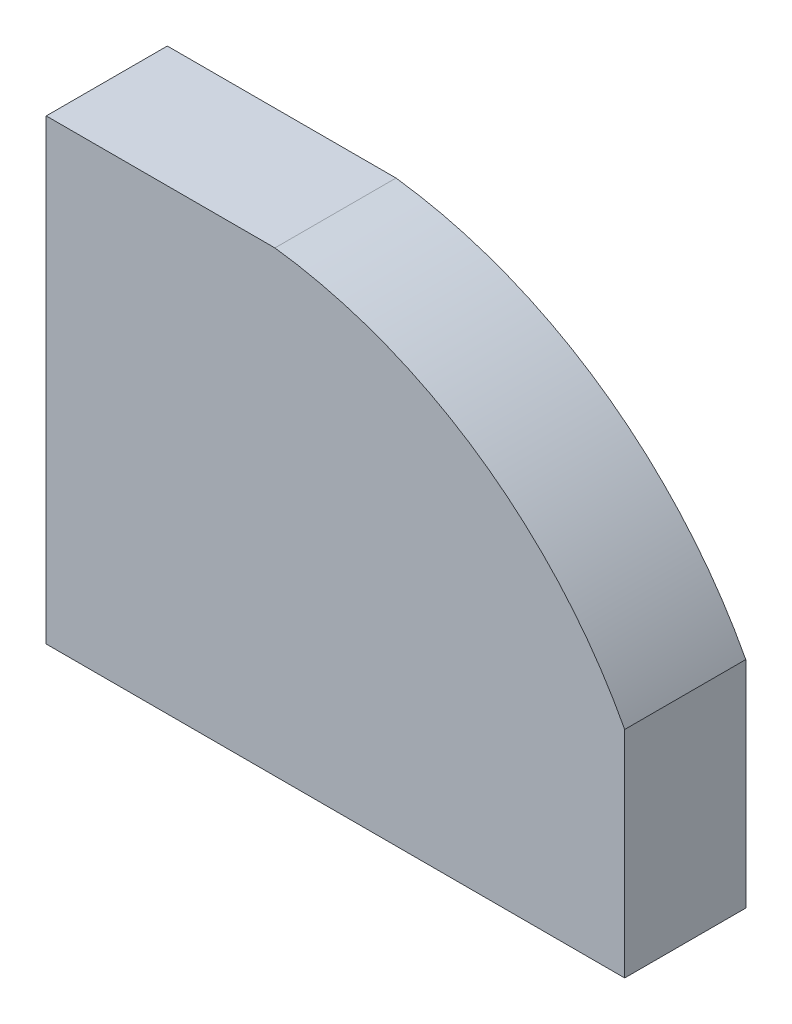
ISO-10303-21;
HEADER;
FILE_DESCRIPTION(('STEP AP214'),'2;1');
FILE_NAME('part.step','',(''),(''),'','','');
FILE_SCHEMA(('AUTOMOTIVE_DESIGN { 1 0 10303 214 1 1 1 1 }'));
ENDSEC;
DATA;
#1=APPLICATION_CONTEXT('core data for automotive mechanical design processes');
#2=APPLICATION_PROTOCOL_DEFINITION('international standard','automotive_design',2000,#1);
#3=PRODUCT_CONTEXT('',#1,'mechanical');
#4=PRODUCT('Part','Part','',(#3));
#5=PRODUCT_RELATED_PRODUCT_CATEGORY('part','',(#4));
#6=PRODUCT_DEFINITION_FORMATION('','',#4);
#7=PRODUCT_DEFINITION_CONTEXT('part definition',#1,'design');
#8=PRODUCT_DEFINITION('design','',#6,#7);
#9=PRODUCT_DEFINITION_SHAPE('','',#8);
#10=(LENGTH_UNIT() NAMED_UNIT(*) SI_UNIT(.MILLI.,.METRE.));
#11=(NAMED_UNIT(*) PLANE_ANGLE_UNIT() SI_UNIT($,.RADIAN.));
#12=(NAMED_UNIT(*) SI_UNIT($,.STERADIAN.) SOLID_ANGLE_UNIT());
#13=UNCERTAINTY_MEASURE_WITH_UNIT(LENGTH_MEASURE(1.E-05),#10,'distance_accuracy_value','');
#14=(GEOMETRIC_REPRESENTATION_CONTEXT(3) GLOBAL_UNCERTAINTY_ASSIGNED_CONTEXT((#13)) GLOBAL_UNIT_ASSIGNED_CONTEXT((#10,
#11,#12)) REPRESENTATION_CONTEXT('',''));
#15=CARTESIAN_POINT('',(0.,0.,0.));
#16=DIRECTION('',(0.,0.,1.));
#17=DIRECTION('',(1.,0.,0.));
#18=AXIS2_PLACEMENT_3D('',#15,#16,#17);
#19=CARTESIAN_POINT('',(12.6923076923077,0.,9.));
#20=DIRECTION('',(0.,0.,-1.));
#21=DIRECTION('',(-1.,0.,0.));
#22=AXIS2_PLACEMENT_3D('',#19,#20,#21);
#23=CYLINDRICAL_SURFACE('',#22,34.2717990922238);
#24=CARTESIAN_POINT('',(12.6923076923077,0.,0.));
#25=DIRECTION('',(0.,0.,1.));
#26=DIRECTION('',(1.,0.,0.));
#27=AXIS2_PLACEMENT_3D('',#24,#25,#26);
#28=CIRCLE('',#27,34.2717990922238);
#29=CARTESIAN_POINT('',(17.,34.,0.));
#30=VERTEX_POINT('',#29);
#31=CARTESIAN_POINT('',(43.,16.,0.));
#32=VERTEX_POINT('',#31);
#33=EDGE_CURVE('E113',#30,#32,#28,.F.);
#34=ORIENTED_EDGE('',*,*,#33,.F.);
#35=DIRECTION('',(0.,0.,-1.));
#36=VECTOR('',#35,1.);
#37=CARTESIAN_POINT('',(17.,34.,9.));
#38=LINE('',#37,#36);
#39=CARTESIAN_POINT('',(17.,34.,9.));
#40=VERTEX_POINT('',#39);
#41=EDGE_CURVE('E11',#40,#30,#38,.T.);
#42=ORIENTED_EDGE('',*,*,#41,.F.);
#43=CARTESIAN_POINT('',(12.6923076923077,0.,9.));
#44=DIRECTION('',(0.,0.,1.));
#45=DIRECTION('',(1.,0.,0.));
#46=AXIS2_PLACEMENT_3D('',#43,#44,#45);
#47=CIRCLE('',#46,34.2717990922238);
#48=CARTESIAN_POINT('',(43.,16.,9.));
#49=VERTEX_POINT('',#48);
#50=EDGE_CURVE('E124',#40,#49,#47,.F.);
#51=ORIENTED_EDGE('',*,*,#50,.T.);
#52=DIRECTION('',(0.,0.,-1.));
#53=VECTOR('',#52,1.);
#54=CARTESIAN_POINT('',(43.,16.,9.));
#55=LINE('',#54,#53);
#56=EDGE_CURVE('E83',#49,#32,#55,.T.);
#57=ORIENTED_EDGE('',*,*,#56,.T.);
#58=EDGE_LOOP('',(#34,#42,#51,#57));
#59=FACE_BOUND('',#58,.T.);
#60=ADVANCED_FACE('F41',(#59),#23,.T.);
#61=CARTESIAN_POINT('',(0.,34.,9.));
#62=DIRECTION('',(0.,1.,0.));
#63=DIRECTION('',(0.,0.,1.));
#64=AXIS2_PLACEMENT_3D('',#61,#62,#63);
#65=PLANE('',#64);
#66=DIRECTION('',(1.,0.,0.));
#67=VECTOR('',#66,1.);
#68=CARTESIAN_POINT('',(0.,34.,0.));
#69=LINE('',#68,#67);
#70=CARTESIAN_POINT('',(0.,34.,0.));
#71=VERTEX_POINT('',#70);
#72=EDGE_CURVE('E116',#71,#30,#69,.T.);
#73=ORIENTED_EDGE('',*,*,#72,.F.);
#74=DIRECTION('',(0.,0.,-1.));
#75=VECTOR('',#74,1.);
#76=CARTESIAN_POINT('',(0.,34.,9.));
#77=LINE('',#76,#75);
#78=CARTESIAN_POINT('',(0.,34.,9.));
#79=VERTEX_POINT('',#78);
#80=EDGE_CURVE('E49',#79,#71,#77,.T.);
#81=ORIENTED_EDGE('',*,*,#80,.F.);
#82=DIRECTION('',(1.,0.,0.));
#83=VECTOR('',#82,1.);
#84=CARTESIAN_POINT('',(0.,34.,9.));
#85=LINE('',#84,#83);
#86=EDGE_CURVE('E99',#79,#40,#85,.T.);
#87=ORIENTED_EDGE('',*,*,#86,.T.);
#88=ORIENTED_EDGE('',*,*,#41,.T.);
#89=EDGE_LOOP('',(#73,#81,#87,#88));
#90=FACE_BOUND('',#89,.T.);
#91=ADVANCED_FACE('F131',(#90),#65,.T.);
#92=CARTESIAN_POINT('',(0.,0.,9.));
#93=DIRECTION('',(1.,0.,0.));
#94=DIRECTION('',(0.,0.,-1.));
#95=AXIS2_PLACEMENT_3D('',#92,#93,#94);
#96=PLANE('',#95);
#97=DIRECTION('',(0.,-1.,0.));
#98=VECTOR('',#97,1.);
#99=CARTESIAN_POINT('',(0.,0.,0.));
#100=LINE('',#99,#98);
#101=CARTESIAN_POINT('',(0.,0.,0.));
#102=VERTEX_POINT('',#101);
#103=EDGE_CURVE('E105',#71,#102,#100,.T.);
#104=ORIENTED_EDGE('',*,*,#103,.T.);
#105=DIRECTION('',(0.,0.,-1.));
#106=VECTOR('',#105,1.);
#107=CARTESIAN_POINT('',(0.,0.,9.));
#108=LINE('',#107,#106);
#109=CARTESIAN_POINT('',(0.,0.,9.));
#110=VERTEX_POINT('',#109);
#111=EDGE_CURVE('E102',#110,#102,#108,.T.);
#112=ORIENTED_EDGE('',*,*,#111,.F.);
#113=DIRECTION('',(0.,-1.,0.));
#114=VECTOR('',#113,1.);
#115=CARTESIAN_POINT('',(0.,0.,9.));
#116=LINE('',#115,#114);
#117=EDGE_CURVE('E93',#79,#110,#116,.T.);
#118=ORIENTED_EDGE('',*,*,#117,.F.);
#119=ORIENTED_EDGE('',*,*,#80,.T.);
#120=EDGE_LOOP('',(#104,#112,#118,#119));
#121=FACE_BOUND('',#120,.T.);
#122=ADVANCED_FACE('F103',(#121),#96,.F.);
#123=CARTESIAN_POINT('',(0.,0.,9.));
#124=DIRECTION('',(0.,1.,0.));
#125=DIRECTION('',(0.,0.,1.));
#126=AXIS2_PLACEMENT_3D('',#123,#124,#125);
#127=PLANE('',#126);
#128=CARTESIAN_POINT('',(3.75,0.,3.75));
#129=DIRECTION('',(0.,-1.,0.));
#130=DIRECTION('',(0.,0.,-1.));
#131=AXIS2_PLACEMENT_3D('',#128,#129,#130);
#132=CIRCLE('',#131,1.75);
#133=CARTESIAN_POINT('',(3.75,0.,2.));
#134=VERTEX_POINT('',#133);
#135=EDGE_CURVE('E142',#134,#134,#132,.T.);
#136=ORIENTED_EDGE('',*,*,#135,.F.);
#137=EDGE_LOOP('',(#136));
#138=FACE_BOUND('',#137,.T.);
#139=CARTESIAN_POINT('',(39.25,0.,3.75000000000022));
#140=DIRECTION('',(0.,-1.,0.));
#141=DIRECTION('',(0.,0.,1.));
#142=AXIS2_PLACEMENT_3D('',#139,#140,#141);
#143=CIRCLE('',#142,1.74999999999994);
#144=CARTESIAN_POINT('',(39.25,0.,5.50000000000016));
#145=VERTEX_POINT('',#144);
#146=EDGE_CURVE('E139',#145,#145,#143,.T.);
#147=ORIENTED_EDGE('',*,*,#146,.F.);
#148=EDGE_LOOP('',(#147));
#149=FACE_BOUND('',#148,.T.);
#150=DIRECTION('',(1.,0.,0.));
#151=VECTOR('',#150,1.);
#152=CARTESIAN_POINT('',(0.,0.,0.));
#153=LINE('',#152,#151);
#154=CARTESIAN_POINT('',(43.,0.,0.));
#155=VERTEX_POINT('',#154);
#156=EDGE_CURVE('E76',#102,#155,#153,.T.);
#157=ORIENTED_EDGE('',*,*,#156,.T.);
#158=DIRECTION('',(0.,0.,-1.));
#159=VECTOR('',#158,1.);
#160=CARTESIAN_POINT('',(43.,0.,9.));
#161=LINE('',#160,#159);
#162=CARTESIAN_POINT('',(43.,0.,9.));
#163=VERTEX_POINT('',#162);
#164=EDGE_CURVE('E106',#163,#155,#161,.T.);
#165=ORIENTED_EDGE('',*,*,#164,.F.);
#166=DIRECTION('',(1.,0.,0.));
#167=VECTOR('',#166,1.);
#168=CARTESIAN_POINT('',(0.,0.,9.));
#169=LINE('',#168,#167);
#170=EDGE_CURVE('E97',#110,#163,#169,.T.);
#171=ORIENTED_EDGE('',*,*,#170,.F.);
#172=ORIENTED_EDGE('',*,*,#111,.T.);
#173=EDGE_LOOP('',(#157,#165,#171,#172));
#174=FACE_BOUND('',#173,.T.);
#175=ADVANCED_FACE('F108',(#138,#149,#174),#127,.F.);
#176=CARTESIAN_POINT('',(43.,0.,9.));
#177=DIRECTION('',(-1.,0.,0.));
#178=DIRECTION('',(0.,0.,1.));
#179=AXIS2_PLACEMENT_3D('',#176,#177,#178);
#180=PLANE('',#179);
#181=DIRECTION('',(0.,1.,0.));
#182=VECTOR('',#181,1.);
#183=CARTESIAN_POINT('',(43.,0.,0.));
#184=LINE('',#183,#182);
#185=EDGE_CURVE('E122',#155,#32,#184,.T.);
#186=ORIENTED_EDGE('',*,*,#185,.T.);
#187=ORIENTED_EDGE('',*,*,#56,.F.);
#188=DIRECTION('',(0.,1.,0.));
#189=VECTOR('',#188,1.);
#190=CARTESIAN_POINT('',(43.,0.,9.));
#191=LINE('',#190,#189);
#192=EDGE_CURVE('E57',#163,#49,#191,.T.);
#193=ORIENTED_EDGE('',*,*,#192,.F.);
#194=ORIENTED_EDGE('',*,*,#164,.T.);
#195=EDGE_LOOP('',(#186,#187,#193,#194));
#196=FACE_BOUND('',#195,.T.);
#197=ADVANCED_FACE('F133',(#196),#180,.F.);
#198=CARTESIAN_POINT('',(0.,0.,9.));
#199=DIRECTION('',(0.,0.,1.));
#200=DIRECTION('',(1.,0.,0.));
#201=AXIS2_PLACEMENT_3D('',#198,#199,#200);
#202=PLANE('',#201);
#203=ORIENTED_EDGE('',*,*,#50,.F.);
#204=ORIENTED_EDGE('',*,*,#86,.F.);
#205=ORIENTED_EDGE('',*,*,#117,.T.);
#206=ORIENTED_EDGE('',*,*,#170,.T.);
#207=ORIENTED_EDGE('',*,*,#192,.T.);
#208=EDGE_LOOP('',(#203,#204,#205,#206,#207));
#209=FACE_BOUND('',#208,.T.);
#210=ADVANCED_FACE('F95',(#209),#202,.T.);
#211=CARTESIAN_POINT('',(0.,0.,0.));
#212=DIRECTION('',(0.,0.,1.));
#213=DIRECTION('',(1.,0.,0.));
#214=AXIS2_PLACEMENT_3D('',#211,#212,#213);
#215=PLANE('',#214);
#216=ORIENTED_EDGE('',*,*,#33,.T.);
#217=ORIENTED_EDGE('',*,*,#185,.F.);
#218=ORIENTED_EDGE('',*,*,#156,.F.);
#219=ORIENTED_EDGE('',*,*,#103,.F.);
#220=ORIENTED_EDGE('',*,*,#72,.T.);
#221=EDGE_LOOP('',(#216,#217,#218,#219,#220));
#222=FACE_BOUND('',#221,.T.);
#223=ADVANCED_FACE('F129',(#222),#215,.F.);
#224=CARTESIAN_POINT('',(39.25,5.,3.75000000000022));
#225=DIRECTION('',(0.,-1.,0.));
#226=DIRECTION('',(0.,0.,-1.));
#227=AXIS2_PLACEMENT_3D('',#224,#225,#226);
#228=CYLINDRICAL_SURFACE('',#227,1.74999999999994);
#229=CARTESIAN_POINT('',(39.25,5.,3.75000000000022));
#230=DIRECTION('',(0.,-1.,0.));
#231=DIRECTION('',(0.,0.,1.));
#232=AXIS2_PLACEMENT_3D('',#229,#230,#231);
#233=CIRCLE('',#232,1.74999999999994);
#234=CARTESIAN_POINT('',(39.25,5.,5.50000000000016));
#235=VERTEX_POINT('',#234);
#236=EDGE_CURVE('E136',#235,#235,#233,.T.);
#237=ORIENTED_EDGE('',*,*,#236,.F.);
#238=EDGE_LOOP('',(#237));
#239=FACE_BOUND('',#238,.T.);
#240=ORIENTED_EDGE('',*,*,#146,.T.);
#241=EDGE_LOOP('',(#240));
#242=FACE_BOUND('',#241,.T.);
#243=ADVANCED_FACE('F162',(#239,#242),#228,.F.);
#244=CARTESIAN_POINT('',(39.25,5.,3.75000000000022));
#245=DIRECTION('',(0.,1.,0.));
#246=DIRECTION('',(0.,0.,1.));
#247=AXIS2_PLACEMENT_3D('',#244,#245,#246);
#248=PLANE('',#247);
#249=ORIENTED_EDGE('',*,*,#236,.T.);
#250=EDGE_LOOP('',(#249));
#251=FACE_BOUND('',#250,.T.);
#252=ADVANCED_FACE('F153',(#251),#248,.F.);
#253=CARTESIAN_POINT('',(3.75,5.,3.75));
#254=DIRECTION('',(0.,-1.,0.));
#255=DIRECTION('',(0.,0.,-1.));
#256=AXIS2_PLACEMENT_3D('',#253,#254,#255);
#257=CYLINDRICAL_SURFACE('',#256,1.75);
#258=CARTESIAN_POINT('',(3.75,5.,3.75));
#259=DIRECTION('',(0.,-1.,0.));
#260=DIRECTION('',(0.,0.,-1.));
#261=AXIS2_PLACEMENT_3D('',#258,#259,#260);
#262=CIRCLE('',#261,1.75);
#263=CARTESIAN_POINT('',(3.75,5.,2.));
#264=VERTEX_POINT('',#263);
#265=EDGE_CURVE('E117',#264,#264,#262,.T.);
#266=ORIENTED_EDGE('',*,*,#265,.F.);
#267=EDGE_LOOP('',(#266));
#268=FACE_BOUND('',#267,.T.);
#269=ORIENTED_EDGE('',*,*,#135,.T.);
#270=EDGE_LOOP('',(#269));
#271=FACE_BOUND('',#270,.T.);
#272=ADVANCED_FACE('F150',(#268,#271),#257,.F.);
#273=CARTESIAN_POINT('',(3.75,5.,3.75));
#274=DIRECTION('',(0.,-1.,0.));
#275=DIRECTION('',(0.,0.,-1.));
#276=AXIS2_PLACEMENT_3D('',#273,#274,#275);
#277=PLANE('',#276);
#278=ORIENTED_EDGE('',*,*,#265,.T.);
#279=EDGE_LOOP('',(#278));
#280=FACE_BOUND('',#279,.T.);
#281=ADVANCED_FACE('F148',(#280),#277,.T.);
#282=CLOSED_SHELL('',(#60,#91,#122,#175,#197,#210,#223,#243,#252,#272,#281));
#283=MANIFOLD_SOLID_BREP('B2',#282);
#284=ADVANCED_BREP_SHAPE_REPRESENTATION('',(#18,#283),#14);
#285=SHAPE_DEFINITION_REPRESENTATION(#9,#284);
ENDSEC;
END-ISO-10303-21;
